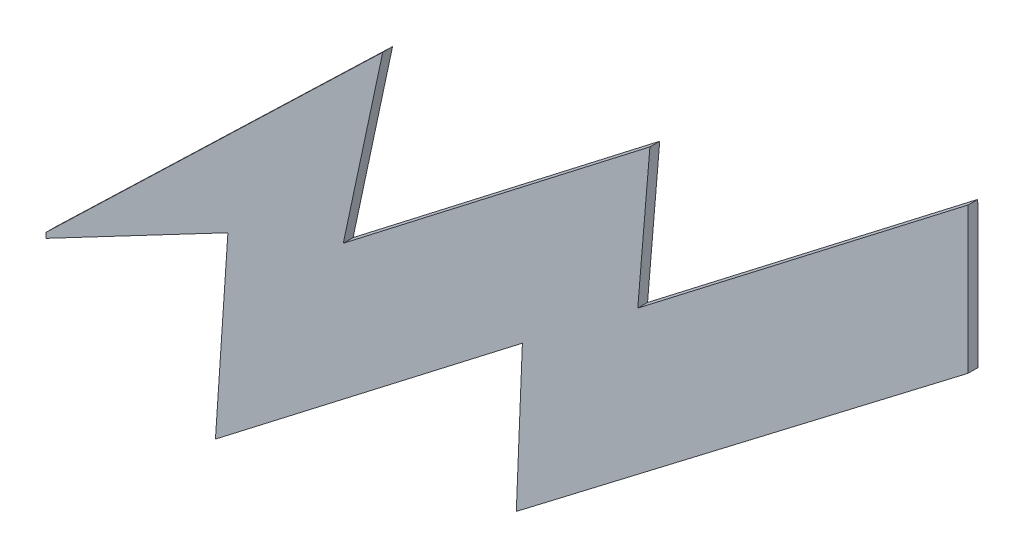
ISO-10303-21;
HEADER;
FILE_DESCRIPTION(('STEP AP214'),'2;1');
FILE_NAME('part.step','',(''),(''),'','','');
FILE_SCHEMA(('AUTOMOTIVE_DESIGN { 1 0 10303 214 1 1 1 1 }'));
ENDSEC;
DATA;
#1=APPLICATION_CONTEXT('core data for automotive mechanical design processes');
#2=APPLICATION_PROTOCOL_DEFINITION('international standard','automotive_design',2000,#1);
#3=PRODUCT_CONTEXT('',#1,'mechanical');
#4=PRODUCT('Part','Part','',(#3));
#5=PRODUCT_RELATED_PRODUCT_CATEGORY('part','',(#4));
#6=PRODUCT_DEFINITION_FORMATION('','',#4);
#7=PRODUCT_DEFINITION_CONTEXT('part definition',#1,'design');
#8=PRODUCT_DEFINITION('design','',#6,#7);
#9=PRODUCT_DEFINITION_SHAPE('','',#8);
#10=(LENGTH_UNIT() NAMED_UNIT(*) SI_UNIT(.MILLI.,.METRE.));
#11=(NAMED_UNIT(*) PLANE_ANGLE_UNIT() SI_UNIT($,.RADIAN.));
#12=(NAMED_UNIT(*) SI_UNIT($,.STERADIAN.) SOLID_ANGLE_UNIT());
#13=UNCERTAINTY_MEASURE_WITH_UNIT(LENGTH_MEASURE(1.E-05),#10,'distance_accuracy_value','');
#14=(GEOMETRIC_REPRESENTATION_CONTEXT(3) GLOBAL_UNCERTAINTY_ASSIGNED_CONTEXT((#13)) GLOBAL_UNIT_ASSIGNED_CONTEXT((#10,
#11,#12)) REPRESENTATION_CONTEXT('',''));
#15=CARTESIAN_POINT('',(0.,0.,0.));
#16=DIRECTION('',(0.,0.,1.));
#17=DIRECTION('',(1.,0.,0.));
#18=AXIS2_PLACEMENT_3D('',#15,#16,#17);
#19=CARTESIAN_POINT('',(46.9732,29.5833,0.5));
#20=DIRECTION('',(-0.999998464179011,-0.00175260937436054,0.));
#21=DIRECTION('',(0.00175260937436054,-0.999998464179011,0.));
#22=AXIS2_PLACEMENT_3D('',#19,#20,#21);
#23=PLANE('',#22);
#24=DIRECTION('',(-0.00175260937436054,0.999998464179011,0.));
#25=VECTOR('',#24,1.);
#26=CARTESIAN_POINT('',(46.9732,29.5833,0.));
#27=LINE('',#26,#25);
#28=CARTESIAN_POINT('',(46.9862,22.1658,0.));
#29=VERTEX_POINT('',#28);
#30=CARTESIAN_POINT('',(46.9732,29.5833,0.));
#31=VERTEX_POINT('',#30);
#32=EDGE_CURVE('E153',#29,#31,#27,.T.);
#33=ORIENTED_EDGE('',*,*,#32,.T.);
#34=DIRECTION('',(0.,0.,-1.));
#35=VECTOR('',#34,1.);
#36=CARTESIAN_POINT('',(46.9732,29.5833,0.5));
#37=LINE('',#36,#35);
#38=CARTESIAN_POINT('',(46.9732,29.5833,0.5));
#39=VERTEX_POINT('',#38);
#40=EDGE_CURVE('E11',#39,#31,#37,.T.);
#41=ORIENTED_EDGE('',*,*,#40,.F.);
#42=DIRECTION('',(-0.00175260937436054,0.999998464179011,0.));
#43=VECTOR('',#42,1.);
#44=CARTESIAN_POINT('',(46.9732,29.5833,0.5));
#45=LINE('',#44,#43);
#46=CARTESIAN_POINT('',(46.9862,22.1658,0.5));
#47=VERTEX_POINT('',#46);
#48=EDGE_CURVE('E175',#47,#39,#45,.T.);
#49=ORIENTED_EDGE('',*,*,#48,.F.);
#50=DIRECTION('',(0.,0.,-1.));
#51=VECTOR('',#50,1.);
#52=CARTESIAN_POINT('',(46.9862,22.1658,0.5));
#53=LINE('',#52,#51);
#54=EDGE_CURVE('E149',#47,#29,#53,.T.);
#55=ORIENTED_EDGE('',*,*,#54,.T.);
#56=EDGE_LOOP('',(#33,#41,#49,#55));
#57=FACE_BOUND('',#56,.T.);
#58=ADVANCED_FACE('F33',(#57),#23,.F.);
#59=CARTESIAN_POINT('',(30.1503,16.6228,0.5));
#60=DIRECTION('',(0.610296580558356,-0.792173013778416,0.));
#61=DIRECTION('',(0.792173013778416,0.610296580558356,0.));
#62=AXIS2_PLACEMENT_3D('',#59,#60,#61);
#63=PLANE('',#62);
#64=DIRECTION('',(-0.792173013778416,-0.610296580558356,0.));
#65=VECTOR('',#64,1.);
#66=CARTESIAN_POINT('',(30.1503,16.6228,0.));
#67=LINE('',#66,#65);
#68=CARTESIAN_POINT('',(30.1503,16.6228,0.));
#69=VERTEX_POINT('',#68);
#70=EDGE_CURVE('E156',#31,#69,#67,.T.);
#71=ORIENTED_EDGE('',*,*,#70,.T.);
#72=DIRECTION('',(0.,0.,-1.));
#73=VECTOR('',#72,1.);
#74=CARTESIAN_POINT('',(30.1503,16.6228,0.5));
#75=LINE('',#74,#73);
#76=CARTESIAN_POINT('',(30.1503,16.6228,0.5));
#77=VERTEX_POINT('',#76);
#78=EDGE_CURVE('E41',#77,#69,#75,.T.);
#79=ORIENTED_EDGE('',*,*,#78,.F.);
#80=DIRECTION('',(-0.792173013778416,-0.610296580558356,0.));
#81=VECTOR('',#80,1.);
#82=CARTESIAN_POINT('',(30.1503,16.6228,0.5));
#83=LINE('',#82,#81);
#84=EDGE_CURVE('E104',#39,#77,#83,.T.);
#85=ORIENTED_EDGE('',*,*,#84,.F.);
#86=ORIENTED_EDGE('',*,*,#40,.T.);
#87=EDGE_LOOP('',(#71,#79,#85,#86));
#88=FACE_BOUND('',#87,.T.);
#89=ADVANCED_FACE('F253',(#88),#63,.F.);
#90=CARTESIAN_POINT('',(30.7693,24.0474,0.5));
#91=DIRECTION('',(-0.996542610261221,0.0830832470101685,0.));
#92=DIRECTION('',(-0.0830832470101685,-0.996542610261221,0.));
#93=AXIS2_PLACEMENT_3D('',#90,#91,#92);
#94=PLANE('',#93);
#95=DIRECTION('',(0.0830832470101685,0.996542610261221,0.));
#96=VECTOR('',#95,1.);
#97=CARTESIAN_POINT('',(30.7693,24.0474,0.));
#98=LINE('',#97,#96);
#99=CARTESIAN_POINT('',(30.7693,24.0474,0.));
#100=VERTEX_POINT('',#99);
#101=EDGE_CURVE('E158',#69,#100,#98,.T.);
#102=ORIENTED_EDGE('',*,*,#101,.T.);
#103=DIRECTION('',(0.,0.,-1.));
#104=VECTOR('',#103,1.);
#105=CARTESIAN_POINT('',(30.7693,24.0474,0.5));
#106=LINE('',#105,#104);
#107=CARTESIAN_POINT('',(30.7693,24.0474,0.5));
#108=VERTEX_POINT('',#107);
#109=EDGE_CURVE('E194',#108,#100,#106,.T.);
#110=ORIENTED_EDGE('',*,*,#109,.F.);
#111=DIRECTION('',(0.0830832470101685,0.996542610261221,0.));
#112=VECTOR('',#111,1.);
#113=CARTESIAN_POINT('',(30.7693,24.0474,0.5));
#114=LINE('',#113,#112);
#115=EDGE_CURVE('E202',#77,#108,#114,.T.);
#116=ORIENTED_EDGE('',*,*,#115,.F.);
#117=ORIENTED_EDGE('',*,*,#78,.T.);
#118=EDGE_LOOP('',(#102,#110,#116,#117));
#119=FACE_BOUND('',#118,.T.);
#120=ADVANCED_FACE('F200',(#119),#94,.F.);
#121=CARTESIAN_POINT('',(15.1465,11.9824,0.5));
#122=DIRECTION('',(0.611220243700489,-0.791460557255202,0.));
#123=DIRECTION('',(0.791460557255202,0.611220243700489,0.));
#124=AXIS2_PLACEMENT_3D('',#121,#122,#123);
#125=PLANE('',#124);
#126=DIRECTION('',(-0.791460557255202,-0.61122024370049,0.));
#127=VECTOR('',#126,1.);
#128=CARTESIAN_POINT('',(15.1465,11.9824,0.));
#129=LINE('',#128,#127);
#130=CARTESIAN_POINT('',(15.1465,11.9824,0.));
#131=VERTEX_POINT('',#130);
#132=EDGE_CURVE('E160',#100,#131,#129,.T.);
#133=ORIENTED_EDGE('',*,*,#132,.T.);
#134=DIRECTION('',(0.,0.,-1.));
#135=VECTOR('',#134,1.);
#136=CARTESIAN_POINT('',(15.1465,11.9824,0.5));
#137=LINE('',#136,#135);
#138=CARTESIAN_POINT('',(15.1465,11.9824,0.5));
#139=VERTEX_POINT('',#138);
#140=EDGE_CURVE('E191',#139,#131,#137,.T.);
#141=ORIENTED_EDGE('',*,*,#140,.F.);
#142=DIRECTION('',(-0.791460557255202,-0.61122024370049,0.));
#143=VECTOR('',#142,1.);
#144=CARTESIAN_POINT('',(15.1465,11.9824,0.5));
#145=LINE('',#144,#143);
#146=EDGE_CURVE('E220',#108,#139,#145,.T.);
#147=ORIENTED_EDGE('',*,*,#146,.F.);
#148=ORIENTED_EDGE('',*,*,#109,.T.);
#149=EDGE_LOOP('',(#133,#141,#147,#148));
#150=FACE_BOUND('',#149,.T.);
#151=ADVANCED_FACE('F211',(#150),#125,.F.);
#152=CARTESIAN_POINT('',(17.1571,21.4182,0.5));
#153=DIRECTION('',(-0.978042947655827,0.2084034369695,0.));
#154=DIRECTION('',(-0.2084034369695,-0.978042947655828,0.));
#155=AXIS2_PLACEMENT_3D('',#152,#153,#154);
#156=PLANE('',#155);
#157=DIRECTION('',(0.2084034369695,0.978042947655828,0.));
#158=VECTOR('',#157,1.);
#159=CARTESIAN_POINT('',(17.1571,21.4182,0.));
#160=LINE('',#159,#158);
#161=CARTESIAN_POINT('',(17.1571,21.4182,0.));
#162=VERTEX_POINT('',#161);
#163=EDGE_CURVE('E162',#131,#162,#160,.T.);
#164=ORIENTED_EDGE('',*,*,#163,.T.);
#165=DIRECTION('',(0.,0.,-1.));
#166=VECTOR('',#165,1.);
#167=CARTESIAN_POINT('',(17.1571,21.4182,0.5));
#168=LINE('',#167,#166);
#169=CARTESIAN_POINT('',(17.1571,21.4182,0.5));
#170=VERTEX_POINT('',#169);
#171=EDGE_CURVE('E188',#170,#162,#168,.T.);
#172=ORIENTED_EDGE('',*,*,#171,.F.);
#173=DIRECTION('',(0.2084034369695,0.978042947655828,0.));
#174=VECTOR('',#173,1.);
#175=CARTESIAN_POINT('',(17.1571,21.4182,0.5));
#176=LINE('',#175,#174);
#177=EDGE_CURVE('E217',#139,#170,#176,.T.);
#178=ORIENTED_EDGE('',*,*,#177,.F.);
#179=ORIENTED_EDGE('',*,*,#140,.T.);
#180=EDGE_LOOP('',(#164,#172,#178,#179));
#181=FACE_BOUND('',#180,.T.);
#182=ADVANCED_FACE('F215',(#181),#156,.F.);
#183=CARTESIAN_POINT('',(0.0119358,4.90343,0.5));
#184=DIRECTION('',(0.693742200878037,-0.720223408895391,0.));
#185=DIRECTION('',(0.720223408895391,0.693742200878037,0.));
#186=AXIS2_PLACEMENT_3D('',#183,#184,#185);
#187=PLANE('',#186);
#188=DIRECTION('',(-0.720223408895391,-0.693742200878037,0.));
#189=VECTOR('',#188,1.);
#190=CARTESIAN_POINT('',(0.0119358,4.90343,0.));
#191=LINE('',#190,#189);
#192=CARTESIAN_POINT('',(0.0119358,4.90343,0.));
#193=VERTEX_POINT('',#192);
#194=EDGE_CURVE('E164',#162,#193,#191,.T.);
#195=ORIENTED_EDGE('',*,*,#194,.T.);
#196=DIRECTION('',(0.,0.,-1.));
#197=VECTOR('',#196,1.);
#198=CARTESIAN_POINT('',(0.0119358,4.90343,0.5));
#199=LINE('',#198,#197);
#200=CARTESIAN_POINT('',(0.0119358,4.90343,0.5));
#201=VERTEX_POINT('',#200);
#202=EDGE_CURVE('E185',#201,#193,#199,.T.);
#203=ORIENTED_EDGE('',*,*,#202,.F.);
#204=DIRECTION('',(-0.720223408895391,-0.693742200878037,0.));
#205=VECTOR('',#204,1.);
#206=CARTESIAN_POINT('',(0.0119358,4.90343,0.5));
#207=LINE('',#206,#205);
#208=EDGE_CURVE('E219',#170,#201,#207,.T.);
#209=ORIENTED_EDGE('',*,*,#208,.F.);
#210=ORIENTED_EDGE('',*,*,#171,.T.);
#211=EDGE_LOOP('',(#195,#203,#209,#210));
#212=FACE_BOUND('',#211,.T.);
#213=ADVANCED_FACE('F266',(#212),#187,.F.);
#214=CARTESIAN_POINT('',(0.,4.62619,0.5));
#215=DIRECTION('',(0.999074539088049,-0.0430123859603491,0.));
#216=DIRECTION('',(0.0430123859603491,0.999074539088049,0.));
#217=AXIS2_PLACEMENT_3D('',#214,#215,#216);
#218=PLANE('',#217);
#219=DIRECTION('',(-0.0430123859603491,-0.999074539088049,0.));
#220=VECTOR('',#219,1.);
#221=CARTESIAN_POINT('',(0.,4.62619,0.));
#222=LINE('',#221,#220);
#223=CARTESIAN_POINT('',(0.,4.62619,0.));
#224=VERTEX_POINT('',#223);
#225=EDGE_CURVE('E166',#193,#224,#222,.T.);
#226=ORIENTED_EDGE('',*,*,#225,.T.);
#227=DIRECTION('',(0.,0.,-1.));
#228=VECTOR('',#227,1.);
#229=CARTESIAN_POINT('',(0.,4.62619,0.5));
#230=LINE('',#229,#228);
#231=CARTESIAN_POINT('',(0.,4.62619,0.5));
#232=VERTEX_POINT('',#231);
#233=EDGE_CURVE('E182',#232,#224,#230,.T.);
#234=ORIENTED_EDGE('',*,*,#233,.F.);
#235=DIRECTION('',(-0.0430123859603491,-0.999074539088049,0.));
#236=VECTOR('',#235,1.);
#237=CARTESIAN_POINT('',(0.,4.62619,0.5));
#238=LINE('',#237,#236);
#239=EDGE_CURVE('E222',#201,#232,#238,.T.);
#240=ORIENTED_EDGE('',*,*,#239,.F.);
#241=ORIENTED_EDGE('',*,*,#202,.T.);
#242=EDGE_LOOP('',(#226,#234,#240,#241));
#243=FACE_BOUND('',#242,.T.);
#244=ADVANCED_FACE('F269',(#243),#218,.F.);
#245=CARTESIAN_POINT('',(9.26867,9.50792,0.5));
#246=DIRECTION('',(-0.466006747498064,0.884781165761498,0.));
#247=DIRECTION('',(-0.884781165761498,-0.466006747498064,0.));
#248=AXIS2_PLACEMENT_3D('',#245,#246,#247);
#249=PLANE('',#248);
#250=DIRECTION('',(0.884781165761498,0.466006747498064,0.));
#251=VECTOR('',#250,1.);
#252=CARTESIAN_POINT('',(9.26867,9.50792,0.));
#253=LINE('',#252,#251);
#254=CARTESIAN_POINT('',(9.26867,9.50792,0.));
#255=VERTEX_POINT('',#254);
#256=EDGE_CURVE('E168',#224,#255,#253,.T.);
#257=ORIENTED_EDGE('',*,*,#256,.T.);
#258=DIRECTION('',(0.,0.,-1.));
#259=VECTOR('',#258,1.);
#260=CARTESIAN_POINT('',(9.26867,9.50792,0.5));
#261=LINE('',#260,#259);
#262=CARTESIAN_POINT('',(9.26867,9.50792,0.5));
#263=VERTEX_POINT('',#262);
#264=EDGE_CURVE('E179',#263,#255,#261,.T.);
#265=ORIENTED_EDGE('',*,*,#264,.F.);
#266=DIRECTION('',(0.884781165761498,0.466006747498064,0.));
#267=VECTOR('',#266,1.);
#268=CARTESIAN_POINT('',(9.26867,9.50792,0.5));
#269=LINE('',#268,#267);
#270=EDGE_CURVE('E228',#232,#263,#269,.T.);
#271=ORIENTED_EDGE('',*,*,#270,.F.);
#272=ORIENTED_EDGE('',*,*,#233,.T.);
#273=EDGE_LOOP('',(#257,#265,#271,#272));
#274=FACE_BOUND('',#273,.T.);
#275=ADVANCED_FACE('F234',(#274),#249,.F.);
#276=CARTESIAN_POINT('',(8.63282,0.0840929,0.5));
#277=DIRECTION('',(0.997731467731119,-0.0673195239073128,0.));
#278=DIRECTION('',(0.0673195239073128,0.997731467731119,0.));
#279=AXIS2_PLACEMENT_3D('',#276,#277,#278);
#280=PLANE('',#279);
#281=DIRECTION('',(-0.0673195239073128,-0.997731467731119,0.));
#282=VECTOR('',#281,1.);
#283=CARTESIAN_POINT('',(8.63282,0.0840929,0.));
#284=LINE('',#283,#282);
#285=CARTESIAN_POINT('',(8.63282,0.0840929,0.));
#286=VERTEX_POINT('',#285);
#287=EDGE_CURVE('E170',#255,#286,#284,.T.);
#288=ORIENTED_EDGE('',*,*,#287,.T.);
#289=DIRECTION('',(0.,0.,-1.));
#290=VECTOR('',#289,1.);
#291=CARTESIAN_POINT('',(8.63282,0.0840929,0.5));
#292=LINE('',#291,#290);
#293=CARTESIAN_POINT('',(8.63282,0.0840929,0.5));
#294=VERTEX_POINT('',#293);
#295=EDGE_CURVE('E144',#294,#286,#292,.T.);
#296=ORIENTED_EDGE('',*,*,#295,.F.);
#297=DIRECTION('',(-0.0673195239073128,-0.997731467731119,0.));
#298=VECTOR('',#297,1.);
#299=CARTESIAN_POINT('',(8.63282,0.0840929,0.5));
#300=LINE('',#299,#298);
#301=EDGE_CURVE('E135',#263,#294,#300,.T.);
#302=ORIENTED_EDGE('',*,*,#301,.F.);
#303=ORIENTED_EDGE('',*,*,#264,.T.);
#304=EDGE_LOOP('',(#288,#296,#302,#303));
#305=FACE_BOUND('',#304,.T.);
#306=ADVANCED_FACE('F238',(#305),#280,.F.);
#307=CARTESIAN_POINT('',(24.2725,12.137,0.5));
#308=DIRECTION('',(-0.610422730269156,0.792075810999648,0.));
#309=DIRECTION('',(-0.792075810999648,-0.610422730269156,0.));
#310=AXIS2_PLACEMENT_3D('',#307,#308,#309);
#311=PLANE('',#310);
#312=DIRECTION('',(0.792075810999648,0.610422730269156,0.));
#313=VECTOR('',#312,1.);
#314=CARTESIAN_POINT('',(24.2725,12.137,0.));
#315=LINE('',#314,#313);
#316=CARTESIAN_POINT('',(24.2725,12.137,0.));
#317=VERTEX_POINT('',#316);
#318=EDGE_CURVE('E143',#286,#317,#315,.T.);
#319=ORIENTED_EDGE('',*,*,#318,.T.);
#320=DIRECTION('',(0.,0.,-1.));
#321=VECTOR('',#320,1.);
#322=CARTESIAN_POINT('',(24.2725,12.137,0.5));
#323=LINE('',#322,#321);
#324=CARTESIAN_POINT('',(24.2725,12.137,0.5));
#325=VERTEX_POINT('',#324);
#326=EDGE_CURVE('E140',#325,#317,#323,.T.);
#327=ORIENTED_EDGE('',*,*,#326,.F.);
#328=DIRECTION('',(0.792075810999648,0.610422730269156,0.));
#329=VECTOR('',#328,1.);
#330=CARTESIAN_POINT('',(24.2725,12.137,0.5));
#331=LINE('',#330,#329);
#332=EDGE_CURVE('E129',#294,#325,#331,.T.);
#333=ORIENTED_EDGE('',*,*,#332,.F.);
#334=ORIENTED_EDGE('',*,*,#295,.T.);
#335=EDGE_LOOP('',(#319,#327,#333,#334));
#336=FACE_BOUND('',#335,.T.);
#337=ADVANCED_FACE('F141',(#336),#311,.F.);
#338=CARTESIAN_POINT('',(23.9632,4.55783,0.5));
#339=DIRECTION('',(0.999168342500294,-0.040775278603771,0.));
#340=DIRECTION('',(0.040775278603771,0.999168342500294,0.));
#341=AXIS2_PLACEMENT_3D('',#338,#339,#340);
#342=PLANE('',#341);
#343=DIRECTION('',(-0.040775278603771,-0.999168342500294,0.));
#344=VECTOR('',#343,1.);
#345=CARTESIAN_POINT('',(23.9632,4.55783,0.));
#346=LINE('',#345,#344);
#347=CARTESIAN_POINT('',(23.9632,4.55783,0.));
#348=VERTEX_POINT('',#347);
#349=EDGE_CURVE('E90',#317,#348,#346,.T.);
#350=ORIENTED_EDGE('',*,*,#349,.T.);
#351=DIRECTION('',(0.,0.,-1.));
#352=VECTOR('',#351,1.);
#353=CARTESIAN_POINT('',(23.9632,4.55783,0.5));
#354=LINE('',#353,#352);
#355=CARTESIAN_POINT('',(23.9632,4.55783,0.5));
#356=VERTEX_POINT('',#355);
#357=EDGE_CURVE('E145',#356,#348,#354,.T.);
#358=ORIENTED_EDGE('',*,*,#357,.F.);
#359=DIRECTION('',(-0.040775278603771,-0.999168342500294,0.));
#360=VECTOR('',#359,1.);
#361=CARTESIAN_POINT('',(23.9632,4.55783,0.5));
#362=LINE('',#361,#360);
#363=EDGE_CURVE('E133',#325,#356,#362,.T.);
#364=ORIENTED_EDGE('',*,*,#363,.F.);
#365=ORIENTED_EDGE('',*,*,#326,.T.);
#366=EDGE_LOOP('',(#350,#358,#364,#365));
#367=FACE_BOUND('',#366,.T.);
#368=ADVANCED_FACE('F147',(#367),#342,.F.);
#369=CARTESIAN_POINT('',(46.9862,22.1658,0.5));
#370=DIRECTION('',(-0.607496836116933,0.794322097204853,0.));
#371=DIRECTION('',(-0.794322097204853,-0.607496836116933,0.));
#372=AXIS2_PLACEMENT_3D('',#369,#370,#371);
#373=PLANE('',#372);
#374=DIRECTION('',(0.794322097204853,0.607496836116933,0.));
#375=VECTOR('',#374,1.);
#376=CARTESIAN_POINT('',(46.9862,22.1658,0.));
#377=LINE('',#376,#375);
#378=EDGE_CURVE('E96',#348,#29,#377,.T.);
#379=ORIENTED_EDGE('',*,*,#378,.T.);
#380=ORIENTED_EDGE('',*,*,#54,.F.);
#381=DIRECTION('',(0.794322097204853,0.607496836116933,0.));
#382=VECTOR('',#381,1.);
#383=CARTESIAN_POINT('',(46.9862,22.1658,0.5));
#384=LINE('',#383,#382);
#385=EDGE_CURVE('E49',#356,#47,#384,.T.);
#386=ORIENTED_EDGE('',*,*,#385,.F.);
#387=ORIENTED_EDGE('',*,*,#357,.T.);
#388=EDGE_LOOP('',(#379,#380,#386,#387));
#389=FACE_BOUND('',#388,.T.);
#390=ADVANCED_FACE('F242',(#389),#373,.F.);
#391=CARTESIAN_POINT('',(0.,0.,0.5));
#392=DIRECTION('',(0.,0.,-1.));
#393=DIRECTION('',(-1.,0.,0.));
#394=AXIS2_PLACEMENT_3D('',#391,#392,#393);
#395=PLANE('',#394);
#396=ORIENTED_EDGE('',*,*,#48,.T.);
#397=ORIENTED_EDGE('',*,*,#84,.T.);
#398=ORIENTED_EDGE('',*,*,#115,.T.);
#399=ORIENTED_EDGE('',*,*,#146,.T.);
#400=ORIENTED_EDGE('',*,*,#177,.T.);
#401=ORIENTED_EDGE('',*,*,#208,.T.);
#402=ORIENTED_EDGE('',*,*,#239,.T.);
#403=ORIENTED_EDGE('',*,*,#270,.T.);
#404=ORIENTED_EDGE('',*,*,#301,.T.);
#405=ORIENTED_EDGE('',*,*,#332,.T.);
#406=ORIENTED_EDGE('',*,*,#363,.T.);
#407=ORIENTED_EDGE('',*,*,#385,.T.);
#408=EDGE_LOOP('',(#396,#397,#398,#399,#400,#401,#402,#403,#404,#405,#406,#407));
#409=FACE_BOUND('',#408,.T.);
#410=ADVANCED_FACE('F131',(#409),#395,.F.);
#411=CARTESIAN_POINT('',(0.,0.,0.));
#412=DIRECTION('',(0.,0.,-1.));
#413=DIRECTION('',(-1.,0.,0.));
#414=AXIS2_PLACEMENT_3D('',#411,#412,#413);
#415=PLANE('',#414);
#416=ORIENTED_EDGE('',*,*,#32,.F.);
#417=ORIENTED_EDGE('',*,*,#378,.F.);
#418=ORIENTED_EDGE('',*,*,#349,.F.);
#419=ORIENTED_EDGE('',*,*,#318,.F.);
#420=ORIENTED_EDGE('',*,*,#287,.F.);
#421=ORIENTED_EDGE('',*,*,#256,.F.);
#422=ORIENTED_EDGE('',*,*,#225,.F.);
#423=ORIENTED_EDGE('',*,*,#194,.F.);
#424=ORIENTED_EDGE('',*,*,#163,.F.);
#425=ORIENTED_EDGE('',*,*,#132,.F.);
#426=ORIENTED_EDGE('',*,*,#101,.F.);
#427=ORIENTED_EDGE('',*,*,#70,.F.);
#428=EDGE_LOOP('',(#416,#417,#418,#419,#420,#421,#422,#423,#424,#425,#426,#427));
#429=FACE_BOUND('',#428,.T.);
#430=ADVANCED_FACE('F206',(#429),#415,.T.);
#431=CLOSED_SHELL('',(#58,#89,#120,#151,#182,#213,#244,#275,#306,#337,#368,#390,#410,#430));
#432=MANIFOLD_SOLID_BREP('B2',#431);
#433=ADVANCED_BREP_SHAPE_REPRESENTATION('',(#18,#432),#14);
#434=SHAPE_DEFINITION_REPRESENTATION(#9,#433);
ENDSEC;
END-ISO-10303-21;
